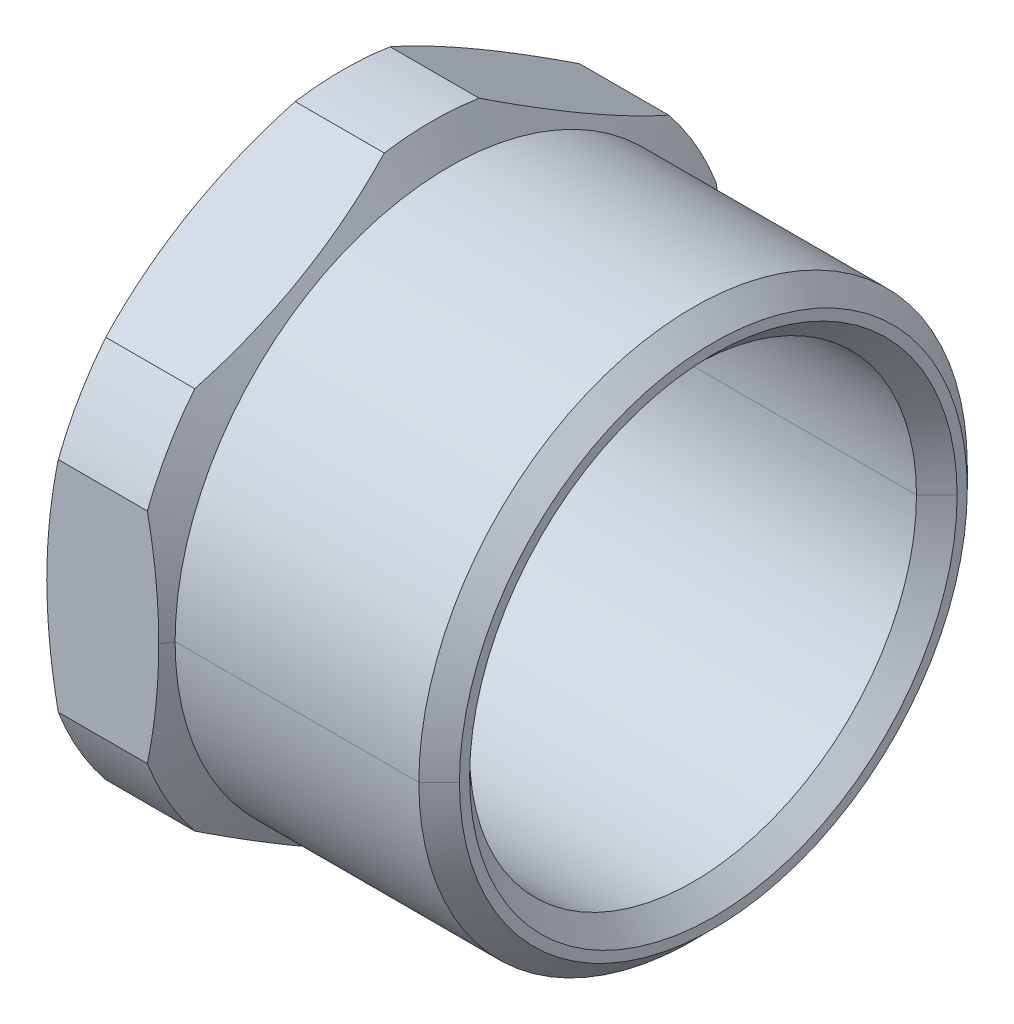
ISO-10303-21;
HEADER;
FILE_DESCRIPTION(('STEP AP214'),'2;1');
FILE_NAME('part.step','',(''),(''),'','','');
FILE_SCHEMA(('AUTOMOTIVE_DESIGN { 1 0 10303 214 1 1 1 1 }'));
ENDSEC;
DATA;
#1=APPLICATION_CONTEXT('core data for automotive mechanical design processes');
#2=APPLICATION_PROTOCOL_DEFINITION('international standard','automotive_design',2000,#1);
#3=PRODUCT_CONTEXT('',#1,'mechanical');
#4=PRODUCT('Part','Part','',(#3));
#5=PRODUCT_RELATED_PRODUCT_CATEGORY('part','',(#4));
#6=PRODUCT_DEFINITION_FORMATION('','',#4);
#7=PRODUCT_DEFINITION_CONTEXT('part definition',#1,'design');
#8=PRODUCT_DEFINITION('design','',#6,#7);
#9=PRODUCT_DEFINITION_SHAPE('','',#8);
#10=(LENGTH_UNIT() NAMED_UNIT(*) SI_UNIT(.MILLI.,.METRE.));
#11=(NAMED_UNIT(*) PLANE_ANGLE_UNIT() SI_UNIT($,.RADIAN.));
#12=(NAMED_UNIT(*) SI_UNIT($,.STERADIAN.) SOLID_ANGLE_UNIT());
#13=UNCERTAINTY_MEASURE_WITH_UNIT(LENGTH_MEASURE(1.E-05),#10,'distance_accuracy_value','');
#14=(GEOMETRIC_REPRESENTATION_CONTEXT(3) GLOBAL_UNCERTAINTY_ASSIGNED_CONTEXT((#13)) GLOBAL_UNIT_ASSIGNED_CONTEXT((#10,
#11,#12)) REPRESENTATION_CONTEXT('',''));
#15=CARTESIAN_POINT('',(0.,0.,0.));
#16=DIRECTION('',(0.,0.,1.));
#17=DIRECTION('',(1.,0.,0.));
#18=AXIS2_PLACEMENT_3D('',#15,#16,#17);
#19=CARTESIAN_POINT('',(32.5,0.,0.));
#20=DIRECTION('',(-1.,0.,0.));
#21=DIRECTION('',(0.,-1.30739807868707E-10,-1.));
#22=AXIS2_PLACEMENT_3D('',#19,#20,#21);
#23=CONICAL_SURFACE('',#22,5.5,0.7853981625);
#24=CARTESIAN_POINT('',(32.5,0.,0.));
#25=DIRECTION('',(-1.,0.,0.));
#26=DIRECTION('',(0.,1.30739807868707E-10,1.));
#27=AXIS2_PLACEMENT_3D('',#24,#25,#26);
#28=CIRCLE('',#27,5.5);
#29=CARTESIAN_POINT('',(32.5,7.19068269722149E-10,5.5));
#30=VERTEX_POINT('',#29);
#31=CARTESIAN_POINT('',(32.5,-7.19068943277889E-10,-5.5));
#32=VERTEX_POINT('',#31);
#33=EDGE_CURVE('E11',#30,#32,#28,.T.);
#34=ORIENTED_EDGE('',*,*,#33,.F.);
#35=DIRECTION('',(-0.707106781821139,9.24469180364172E-11,0.707106780551956));
#36=VECTOR('',#35,1.);
#37=CARTESIAN_POINT('',(32.5,7.19068269722149E-10,5.5));
#38=LINE('',#37,#36);
#39=CARTESIAN_POINT('',(32.,7.8443811230683E-10,5.99999999910255));
#40=VERTEX_POINT('',#39);
#41=EDGE_CURVE('E24',#30,#40,#38,.T.);
#42=ORIENTED_EDGE('',*,*,#41,.T.);
#43=CARTESIAN_POINT('',(32.,0.,0.));
#44=DIRECTION('',(1.,0.,0.));
#45=DIRECTION('',(0.,1.30739807868707E-10,1.));
#46=AXIS2_PLACEMENT_3D('',#43,#44,#45);
#47=CIRCLE('',#46,6.);
#48=CARTESIAN_POINT('',(32.,-7.8443884709491E-10,-5.99999999910255));
#49=VERTEX_POINT('',#48);
#50=EDGE_CURVE('E709',#49,#40,#47,.T.);
#51=ORIENTED_EDGE('',*,*,#50,.F.);
#52=DIRECTION('',(-0.707106781821139,-9.24470046320227E-11,-0.707106780551956));
#53=VECTOR('',#52,1.);
#54=CARTESIAN_POINT('',(32.5,-7.19068943277889E-10,-5.5));
#55=LINE('',#54,#53);
#56=EDGE_CURVE('E41',#32,#49,#55,.T.);
#57=ORIENTED_EDGE('',*,*,#56,.F.);
#58=EDGE_LOOP('',(#34,#42,#51,#57));
#59=FACE_BOUND('',#58,.T.);
#60=ADVANCED_FACE('F16',(#59),#23,.F.);
#61=CARTESIAN_POINT('',(41.5,0.,0.));
#62=DIRECTION('',(1.,0.,0.));
#63=DIRECTION('',(0.,1.30739807868707E-10,1.));
#64=AXIS2_PLACEMENT_3D('',#61,#62,#63);
#65=CONICAL_SURFACE('',#64,6.,0.785398162500002);
#66=CARTESIAN_POINT('',(41.,0.,0.));
#67=DIRECTION('',(1.,0.,0.));
#68=DIRECTION('',(0.,-1.30739807868707E-10,-1.));
#69=AXIS2_PLACEMENT_3D('',#66,#67,#68);
#70=CIRCLE('',#69,5.5);
#71=CARTESIAN_POINT('',(41.,-7.19068943277889E-10,-5.5));
#72=VERTEX_POINT('',#71);
#73=CARTESIAN_POINT('',(41.,7.19068269722149E-10,5.5));
#74=VERTEX_POINT('',#73);
#75=EDGE_CURVE('E706',#72,#74,#70,.T.);
#76=ORIENTED_EDGE('',*,*,#75,.F.);
#77=DIRECTION('',(0.707106781821138,-9.24470912276284E-11,-0.707106780551957));
#78=VECTOR('',#77,1.);
#79=CARTESIAN_POINT('',(41.5,-7.84439582000322E-10,-6.));
#80=LINE('',#79,#78);
#81=CARTESIAN_POINT('',(41.5,-7.84439582000322E-10,-6.));
#82=VERTEX_POINT('',#81);
#83=EDGE_CURVE('E838',#72,#82,#80,.T.);
#84=ORIENTED_EDGE('',*,*,#83,.T.);
#85=CARTESIAN_POINT('',(41.5,0.,0.));
#86=DIRECTION('',(-1.,0.,0.));
#87=DIRECTION('',(0.,-1.30739807868707E-10,-1.));
#88=AXIS2_PLACEMENT_3D('',#85,#86,#87);
#89=CIRCLE('',#88,6.);
#90=CARTESIAN_POINT('',(41.5,7.84438847212242E-10,6.));
#91=VERTEX_POINT('',#90);
#92=EDGE_CURVE('E835',#91,#82,#89,.T.);
#93=ORIENTED_EDGE('',*,*,#92,.F.);
#94=DIRECTION('',(0.707106781821138,9.24470046320229E-11,0.707106780551957));
#95=VECTOR('',#94,1.);
#96=CARTESIAN_POINT('',(41.5,7.84438847212242E-10,6.));
#97=LINE('',#96,#95);
#98=EDGE_CURVE('E832',#74,#91,#97,.T.);
#99=ORIENTED_EDGE('',*,*,#98,.F.);
#100=EDGE_LOOP('',(#76,#84,#93,#99));
#101=FACE_BOUND('',#100,.T.);
#102=ADVANCED_FACE('F697',(#101),#65,.F.);
#103=CARTESIAN_POINT('',(41.5,0.,0.));
#104=DIRECTION('',(-1.,0.,0.));
#105=DIRECTION('',(0.,-1.30739807868707E-10,-1.));
#106=AXIS2_PLACEMENT_3D('',#103,#104,#105);
#107=CONICAL_SURFACE('',#106,6.25,0.785398162500002);
#108=CARTESIAN_POINT('',(41.5,0.,0.));
#109=DIRECTION('',(1.,0.,0.));
#110=DIRECTION('',(0.,-1.30739807868707E-10,-1.));
#111=AXIS2_PLACEMENT_3D('',#108,#109,#110);
#112=CIRCLE('',#111,6.25);
#113=CARTESIAN_POINT('',(41.5,8.49807738227076E-10,6.25));
#114=VERTEX_POINT('',#113);
#115=CARTESIAN_POINT('',(41.5,-8.17124016019853E-10,-6.25));
#116=VERTEX_POINT('',#115);
#117=EDGE_CURVE('E829',#114,#116,#112,.T.);
#118=ORIENTED_EDGE('',*,*,#117,.F.);
#119=DIRECTION('',(-0.707106781821138,9.24469180364173E-11,0.707106780551957));
#120=VECTOR('',#119,1.);
#121=CARTESIAN_POINT('',(41.5,8.17122816934735E-10,6.25));
#122=LINE('',#121,#120);
#123=CARTESIAN_POINT('',(41.,8.82493486273338E-10,6.75));
#124=VERTEX_POINT('',#123);
#125=EDGE_CURVE('E826',#114,#124,#122,.T.);
#126=ORIENTED_EDGE('',*,*,#125,.T.);
#127=CARTESIAN_POINT('',(41.,0.,0.));
#128=DIRECTION('',(-1.,0.,0.));
#129=DIRECTION('',(0.,-1.30739807868707E-10,-1.));
#130=AXIS2_PLACEMENT_3D('',#127,#128,#129);
#131=CIRCLE('',#130,6.75);
#132=CARTESIAN_POINT('',(41.,-8.82494746590796E-10,-6.75));
#133=VERTEX_POINT('',#132);
#134=EDGE_CURVE('E823',#133,#124,#131,.T.);
#135=ORIENTED_EDGE('',*,*,#134,.F.);
#136=DIRECTION('',(-0.707106781821138,-9.24470046320229E-11,-0.707106780551957));
#137=VECTOR('',#136,1.);
#138=CARTESIAN_POINT('',(41.5,-8.17124016019853E-10,-6.25));
#139=LINE('',#138,#137);
#140=EDGE_CURVE('E810',#116,#133,#139,.T.);
#141=ORIENTED_EDGE('',*,*,#140,.F.);
#142=EDGE_LOOP('',(#118,#126,#135,#141));
#143=FACE_BOUND('',#142,.T.);
#144=ADVANCED_FACE('F601',(#143),#107,.T.);
#145=CARTESIAN_POINT('',(34.5669872981078,0.,0.));
#146=DIRECTION('',(-1.,0.,0.));
#147=DIRECTION('',(0.,-1.30739807868707E-10,-1.));
#148=AXIS2_PLACEMENT_3D('',#145,#146,#147);
#149=CONICAL_SURFACE('',#148,7.5,1.04719755);
#150=CARTESIAN_POINT('',(35.,0.,0.));
#151=DIRECTION('',(1.,0.,0.));
#152=DIRECTION('',(0.,-1.30739807868707E-10,-1.));
#153=AXIS2_PLACEMENT_3D('',#150,#151,#152);
#154=CIRCLE('',#153,6.75);
#155=CARTESIAN_POINT('',(35.,8.82493486273338E-10,6.75));
#156=VERTEX_POINT('',#155);
#157=CARTESIAN_POINT('',(35.,-8.82494746590796E-10,-6.75));
#158=VERTEX_POINT('',#157);
#159=EDGE_CURVE('E807',#156,#158,#154,.T.);
#160=ORIENTED_EDGE('',*,*,#159,.F.);
#161=DIRECTION('',(-0.500000001036284,1.13223888764452E-10,0.86602540318614));
#162=VECTOR('',#161,1.);
#163=CARTESIAN_POINT('',(34.5669872981078,9.80547423689769E-10,7.5));
#164=LINE('',#163,#162);
#165=CARTESIAN_POINT('',(34.8493881323621,-1.6731625299066E-08,7.00253407432229));
#166=VERTEX_POINT('',#165);
#167=EDGE_CURVE('E811',#156,#166,#164,.T.);
#168=ORIENTED_EDGE('',*,*,#167,.T.);
#169=CARTESIAN_POINT('',(34.5669872981078,-2.69258240265207,7.00000000035203));
#170=CARTESIAN_POINT('',(34.7530223848469,-1.79505493479531,7.00000000023469));
#171=CARTESIAN_POINT('',(34.8460399282163,-0.897527466938505,7.00000000011734));
#172=CARTESIAN_POINT('',(34.8493881323621,-1.67319566034561E-08,7.));
#173=B_SPLINE_CURVE_WITH_KNOTS('',3,(#169,#170,#171,#172),.UNSPECIFIED.,.F.,.F.,(4,4),(0.,
0.500000000000605),.UNSPECIFIED.);
#174=CARTESIAN_POINT('',(34.5669872981078,-2.69258240265207,7.00000000035203));
#175=VERTEX_POINT('',#174);
#176=EDGE_CURVE('E221',#175,#166,#173,.T.);
#177=ORIENTED_EDGE('',*,*,#176,.F.);
#178=CARTESIAN_POINT('',(34.5669872981078,0.,0.));
#179=DIRECTION('',(-1.,0.,0.));
#180=DIRECTION('',(0.,-1.30739807868707E-10,-1.));
#181=AXIS2_PLACEMENT_3D('',#178,#179,#180);
#182=CIRCLE('',#181,7.5);
#183=CARTESIAN_POINT('',(34.5669872981078,-4.71588662394499,5.83184476388876));
#184=VERTEX_POINT('',#183);
#185=EDGE_CURVE('E585',#184,#175,#182,.T.);
#186=ORIENTED_EDGE('',*,*,#185,.F.);
#187=CARTESIAN_POINT('',(34.5669872981078,-7.40846902812197,1.16815523769638));
#188=CARTESIAN_POINT('',(34.9390574715856,-6.51094156006305,2.72271841309372));
#189=CARTESIAN_POINT('',(34.9390574715856,-5.61341409200405,4.27728158849118));
#190=CARTESIAN_POINT('',(34.5669872981078,-4.71588662394499,5.83184476388876));
#191=B_SPLINE_CURVE_WITH_KNOTS('',3,(#187,#188,#189,#190),.UNSPECIFIED.,.F.,.F.,(4,4),(0.,1.),.UNSPECIFIED.);
#192=CARTESIAN_POINT('',(34.5669872981078,-7.40846902812197,1.16815523769638));
#193=VERTEX_POINT('',#192);
#194=EDGE_CURVE('E581',#193,#184,#191,.T.);
#195=ORIENTED_EDGE('',*,*,#194,.F.);
#196=CARTESIAN_POINT('',(34.5669872981078,0.,0.));
#197=DIRECTION('',(-1.,0.,0.));
#198=DIRECTION('',(0.,-1.30739807868707E-10,-1.));
#199=AXIS2_PLACEMENT_3D('',#196,#197,#198);
#200=CIRCLE('',#199,7.5);
#201=CARTESIAN_POINT('',(34.5669872981078,-7.40846902842742,-1.16815523575921));
#202=VERTEX_POINT('',#201);
#203=EDGE_CURVE('E640',#202,#193,#200,.T.);
#204=ORIENTED_EDGE('',*,*,#203,.F.);
#205=CARTESIAN_POINT('',(34.5669872981078,-4.7158866254699,-5.83184476265565));
#206=CARTESIAN_POINT('',(34.9390574715856,-5.61341409312234,-4.27728158702363));
#207=CARTESIAN_POINT('',(34.9390574715856,-6.51094156077485,-2.72271841139148));
#208=CARTESIAN_POINT('',(34.5669872981078,-7.40846902842742,-1.16815523575921));
#209=B_SPLINE_CURVE_WITH_KNOTS('',3,(#205,#206,#207,#208),.UNSPECIFIED.,.F.,.F.,(4,4),(0.,1.),.UNSPECIFIED.);
#210=CARTESIAN_POINT('',(34.5669872981078,-4.7158866254699,-5.83184476265565));
#211=VERTEX_POINT('',#210);
#212=EDGE_CURVE('E625',#211,#202,#209,.T.);
#213=ORIENTED_EDGE('',*,*,#212,.F.);
#214=CARTESIAN_POINT('',(34.5669872981078,0.,0.));
#215=DIRECTION('',(-1.,0.,0.));
#216=DIRECTION('',(0.,-1.30739807868707E-10,-1.));
#217=AXIS2_PLACEMENT_3D('',#214,#215,#216);
#218=CIRCLE('',#217,7.5);
#219=CARTESIAN_POINT('',(34.5669872981078,-2.69258240448243,-6.99999999964797));
#220=VERTEX_POINT('',#219);
#221=EDGE_CURVE('E616',#220,#211,#218,.T.);
#222=ORIENTED_EDGE('',*,*,#221,.F.);
#223=CARTESIAN_POINT('',(34.8493881356448,-6.25313117907599E-08,-7.));
#224=CARTESIAN_POINT('',(34.8460399282113,-0.897527468817098,-6.99999999988266));
#225=CARTESIAN_POINT('',(34.7530223848419,-1.79505493664975,-6.99999999976531));
#226=CARTESIAN_POINT('',(34.5669872981078,-2.69258240448243,-6.99999999964797));
#227=B_SPLINE_CURVE_WITH_KNOTS('',3,(#223,#224,#225,#226),.UNSPECIFIED.,.F.,.F.,(4,4),
(0.500000000012889,1.),.UNSPECIFIED.);
#228=CARTESIAN_POINT('',(34.8493881356448,-6.25316430953912E-08,-7.00253406863652));
#229=VERTEX_POINT('',#228);
#230=EDGE_CURVE('E654',#229,#220,#227,.T.);
#231=ORIENTED_EDGE('',*,*,#230,.F.);
#232=DIRECTION('',(-0.500000001036284,-1.13223994821975E-10,-0.86602540318614));
#233=VECTOR('',#232,1.);
#234=CARTESIAN_POINT('',(34.5669872981078,-9.80548775855737E-10,-7.5));
#235=LINE('',#234,#233);
#236=EDGE_CURVE('E407',#158,#229,#235,.T.);
#237=ORIENTED_EDGE('',*,*,#236,.F.);
#238=EDGE_LOOP('',(#160,#168,#177,#186,#195,#204,#213,#222,#231,#237));
#239=FACE_BOUND('',#238,.T.);
#240=ADVANCED_FACE('F592',(#239),#149,.T.);
#241=CARTESIAN_POINT('',(41.5,0.,0.));
#242=DIRECTION('',(-1.,0.,0.));
#243=DIRECTION('',(0.,-1.30739807868707E-10,-1.));
#244=AXIS2_PLACEMENT_3D('',#241,#242,#243);
#245=CYLINDRICAL_SURFACE('',#244,5.5);
#246=ORIENTED_EDGE('',*,*,#75,.T.);
#247=DIRECTION('',(-1.,0.,0.));
#248=VECTOR('',#247,1.);
#249=CARTESIAN_POINT('',(41.5,7.19068269722149E-10,5.5));
#250=LINE('',#249,#248);
#251=EDGE_CURVE('E660',#74,#30,#250,.T.);
#252=ORIENTED_EDGE('',*,*,#251,.T.);
#253=ORIENTED_EDGE('',*,*,#33,.T.);
#254=DIRECTION('',(-1.,0.,0.));
#255=VECTOR('',#254,1.);
#256=CARTESIAN_POINT('',(41.5,-7.19068943277889E-10,-5.5));
#257=LINE('',#256,#255);
#258=EDGE_CURVE('E663',#72,#32,#257,.T.);
#259=ORIENTED_EDGE('',*,*,#258,.F.);
#260=EDGE_LOOP('',(#246,#252,#253,#259));
#261=FACE_BOUND('',#260,.T.);
#262=ADVANCED_FACE('F523',(#261),#245,.F.);
#263=CARTESIAN_POINT('',(32.3752776749733,0.,0.));
#264=DIRECTION('',(1.,0.,0.));
#265=DIRECTION('',(0.,1.30739807868707E-10,1.));
#266=AXIS2_PLACEMENT_3D('',#263,#264,#265);
#267=CONICAL_SURFACE('',#266,7.5,1.04719755);
#268=CARTESIAN_POINT('',(32.,0.,0.));
#269=DIRECTION('',(-1.,0.,0.));
#270=DIRECTION('',(0.,1.30739807868707E-10,1.));
#271=AXIS2_PLACEMENT_3D('',#268,#269,#270);
#272=CIRCLE('',#271,6.85);
#273=CARTESIAN_POINT('',(32.,-9.38059216982486E-10,-6.85));
#274=VERTEX_POINT('',#273);
#275=CARTESIAN_POINT('',(32.,8.95567467060209E-10,6.85));
#276=VERTEX_POINT('',#275);
#277=EDGE_CURVE('E670',#274,#276,#272,.T.);
#278=ORIENTED_EDGE('',*,*,#277,.F.);
#279=DIRECTION('',(0.500000001036283,-1.13224100879499E-10,-0.866025403186141));
#280=VECTOR('',#279,1.);
#281=CARTESIAN_POINT('',(32.3752776749733,-9.80549694340836E-10,-7.5));
#282=LINE('',#281,#280);
#283=CARTESIAN_POINT('',(32.092876840719,-1.85626435755762E-08,-7.00253407432229));
#284=VERTEX_POINT('',#283);
#285=EDGE_CURVE('E367',#274,#284,#282,.T.);
#286=ORIENTED_EDGE('',*,*,#285,.T.);
#287=CARTESIAN_POINT('',(32.3752776749733,-2.69258240448243,-6.99999999964797));
#288=CARTESIAN_POINT('',(32.1892425882342,-1.79505493662567,-6.99999999976531));
#289=CARTESIAN_POINT('',(32.0962250448648,-0.897527468768869,-6.99999999988266));
#290=CARTESIAN_POINT('',(32.092876840719,-1.85623122702015E-08,-7.));
#291=B_SPLINE_CURVE_WITH_KNOTS('',3,(#287,#288,#289,#290),.UNSPECIFIED.,.F.,.F.,(4,4),(0.,
0.500000000000607),.UNSPECIFIED.);
#292=CARTESIAN_POINT('',(32.3752776749733,-2.69258240448243,-6.99999999964797));
#293=VERTEX_POINT('',#292);
#294=EDGE_CURVE('E674',#293,#284,#291,.T.);
#295=ORIENTED_EDGE('',*,*,#294,.F.);
#296=CARTESIAN_POINT('',(32.3752776749733,0.,0.));
#297=DIRECTION('',(1.,0.,0.));
#298=DIRECTION('',(0.,1.30739807868707E-10,1.));
#299=AXIS2_PLACEMENT_3D('',#296,#297,#298);
#300=CIRCLE('',#299,7.5);
#301=CARTESIAN_POINT('',(32.3752776749733,-4.7158866254699,-5.83184476265565));
#302=VERTEX_POINT('',#301);
#303=EDGE_CURVE('E686',#302,#293,#300,.T.);
#304=ORIENTED_EDGE('',*,*,#303,.F.);
#305=CARTESIAN_POINT('',(32.3752776749733,-7.40846902842742,-1.16815523575921));
#306=CARTESIAN_POINT('',(32.0032075014955,-6.51094156077499,-2.72271841139122));
#307=CARTESIAN_POINT('',(32.0032075014955,-5.61341409312248,-4.27728158702337));
#308=CARTESIAN_POINT('',(32.3752776749733,-4.7158866254699,-5.83184476265565));
#309=B_SPLINE_CURVE_WITH_KNOTS('',3,(#305,#306,#307,#308),.UNSPECIFIED.,.F.,.F.,(4,4),(0.,1.),.UNSPECIFIED.);
#310=CARTESIAN_POINT('',(32.3752776749733,-7.40846902842742,-1.16815523575921));
#311=VERTEX_POINT('',#310);
#312=EDGE_CURVE('E690',#311,#302,#309,.T.);
#313=ORIENTED_EDGE('',*,*,#312,.F.);
#314=CARTESIAN_POINT('',(32.3752776749733,0.,0.));
#315=DIRECTION('',(1.,0.,0.));
#316=DIRECTION('',(0.,1.30739807868707E-10,1.));
#317=AXIS2_PLACEMENT_3D('',#314,#315,#316);
#318=CIRCLE('',#317,7.5);
#319=CARTESIAN_POINT('',(32.3752776749733,-7.40846902812197,1.16815523769638));
#320=VERTEX_POINT('',#319);
#321=EDGE_CURVE('E758',#320,#311,#318,.T.);
#322=ORIENTED_EDGE('',*,*,#321,.F.);
#323=CARTESIAN_POINT('',(32.3752776749733,-4.71588662394499,5.83184476388876));
#324=CARTESIAN_POINT('',(32.0032075014955,-5.61341409200391,4.27728158849144));
#325=CARTESIAN_POINT('',(32.0032075014955,-6.5109415600629,2.72271841309398));
#326=CARTESIAN_POINT('',(32.3752776749733,-7.40846902812197,1.16815523769638));
#327=B_SPLINE_CURVE_WITH_KNOTS('',3,(#323,#324,#325,#326),.UNSPECIFIED.,.F.,.F.,(4,4),(0.,1.),.UNSPECIFIED.);
#328=CARTESIAN_POINT('',(32.3752776749733,-4.71588662394499,5.83184476388876));
#329=VERTEX_POINT('',#328);
#330=EDGE_CURVE('E550',#329,#320,#327,.T.);
#331=ORIENTED_EDGE('',*,*,#330,.F.);
#332=CARTESIAN_POINT('',(32.3752776749733,0.,0.));
#333=DIRECTION('',(1.,0.,0.));
#334=DIRECTION('',(0.,1.30739807868707E-10,1.));
#335=AXIS2_PLACEMENT_3D('',#332,#333,#334);
#336=CIRCLE('',#335,7.5);
#337=CARTESIAN_POINT('',(32.3752776749733,-2.69258240265207,7.00000000035203));
#338=VERTEX_POINT('',#337);
#339=EDGE_CURVE('E541',#338,#329,#336,.T.);
#340=ORIENTED_EDGE('',*,*,#339,.F.);
#341=CARTESIAN_POINT('',(32.0928768374364,-6.07009589203298E-08,7.));
#342=CARTESIAN_POINT('',(32.0962250448698,-0.897527466986735,7.00000000011734));
#343=CARTESIAN_POINT('',(32.1892425882392,-1.79505493481938,7.00000000023469));
#344=CARTESIAN_POINT('',(32.3752776749733,-2.69258240265207,7.00000000035203));
#345=B_SPLINE_CURVE_WITH_KNOTS('',3,(#341,#342,#343,#344),.UNSPECIFIED.,.F.,.F.,(4,4),
(0.500000000012891,1.),.UNSPECIFIED.);
#346=CARTESIAN_POINT('',(32.0928768374364,-6.07006276166832E-08,7.00253406863652));
#347=VERTEX_POINT('',#346);
#348=EDGE_CURVE('E506',#347,#338,#345,.T.);
#349=ORIENTED_EDGE('',*,*,#348,.F.);
#350=DIRECTION('',(0.500000001036283,1.13223994821976E-10,0.866025403186141));
#351=VECTOR('',#350,1.);
#352=CARTESIAN_POINT('',(32.3752776749733,9.80548342174868E-10,7.5));
#353=LINE('',#352,#351);
#354=EDGE_CURVE('E501',#276,#347,#353,.T.);
#355=ORIENTED_EDGE('',*,*,#354,.F.);
#356=EDGE_LOOP('',(#278,#286,#295,#304,#313,#322,#331,#340,#349,#355));
#357=FACE_BOUND('',#356,.T.);
#358=ADVANCED_FACE('F512',(#357),#267,.T.);
#359=CARTESIAN_POINT('',(38.25,0.,0.));
#360=DIRECTION('',(1.,0.,0.));
#361=DIRECTION('',(0.,1.30739807868707E-10,1.));
#362=AXIS2_PLACEMENT_3D('',#359,#360,#361);
#363=CYLINDRICAL_SURFACE('',#362,6.75);
#364=ORIENTED_EDGE('',*,*,#159,.T.);
#365=DIRECTION('',(1.,0.,0.));
#366=VECTOR('',#365,1.);
#367=CARTESIAN_POINT('',(38.25,-8.82494746590796E-10,-6.75));
#368=LINE('',#367,#366);
#369=EDGE_CURVE('E497',#158,#133,#368,.T.);
#370=ORIENTED_EDGE('',*,*,#369,.T.);
#371=ORIENTED_EDGE('',*,*,#134,.T.);
#372=DIRECTION('',(1.,0.,0.));
#373=VECTOR('',#372,1.);
#374=CARTESIAN_POINT('',(38.25,8.82493486273338E-10,6.75));
#375=LINE('',#374,#373);
#376=EDGE_CURVE('E494',#156,#124,#375,.T.);
#377=ORIENTED_EDGE('',*,*,#376,.F.);
#378=EDGE_LOOP('',(#364,#370,#371,#377));
#379=FACE_BOUND('',#378,.T.);
#380=ADVANCED_FACE('F522',(#379),#363,.T.);
#381=CARTESIAN_POINT('',(32.,0.,0.));
#382=DIRECTION('',(1.,0.,0.));
#383=DIRECTION('',(0.,1.30739807868707E-10,1.));
#384=AXIS2_PLACEMENT_3D('',#381,#382,#383);
#385=CYLINDRICAL_SURFACE('',#384,7.5);
#386=DIRECTION('',(-1.,0.,0.));
#387=VECTOR('',#386,1.);
#388=CARTESIAN_POINT('',(32.,7.40846902842742,1.16815523575921));
#389=LINE('',#388,#387);
#390=CARTESIAN_POINT('',(34.5669872981078,7.40846902842742,1.16815523575921));
#391=VERTEX_POINT('',#390);
#392=CARTESIAN_POINT('',(32.3752776749733,7.40846902842742,1.16815523575921));
#393=VERTEX_POINT('',#392);
#394=EDGE_CURVE('E418',#391,#393,#389,.T.);
#395=ORIENTED_EDGE('',*,*,#394,.F.);
#396=CARTESIAN_POINT('',(34.5669872981078,0.,0.));
#397=DIRECTION('',(-1.,0.,0.));
#398=DIRECTION('',(0.,-1.30739807868707E-10,-1.));
#399=AXIS2_PLACEMENT_3D('',#396,#397,#398);
#400=CIRCLE('',#399,7.5);
#401=CARTESIAN_POINT('',(34.5669872981078,7.40846902812197,-1.16815523769638));
#402=VERTEX_POINT('',#401);
#403=EDGE_CURVE('E486',#391,#402,#400,.T.);
#404=ORIENTED_EDGE('',*,*,#403,.T.);
#405=DIRECTION('',(1.,0.,0.));
#406=VECTOR('',#405,1.);
#407=CARTESIAN_POINT('',(32.,7.40846902812197,-1.16815523769638));
#408=LINE('',#407,#406);
#409=CARTESIAN_POINT('',(32.3752776749733,7.40846902812197,-1.16815523769638));
#410=VERTEX_POINT('',#409);
#411=EDGE_CURVE('E481',#410,#402,#408,.T.);
#412=ORIENTED_EDGE('',*,*,#411,.F.);
#413=CARTESIAN_POINT('',(32.3752776749733,0.,0.));
#414=DIRECTION('',(1.,0.,0.));
#415=DIRECTION('',(0.,1.30739807868707E-10,1.));
#416=AXIS2_PLACEMENT_3D('',#413,#414,#415);
#417=CIRCLE('',#416,7.5);
#418=EDGE_CURVE('E477',#410,#393,#417,.T.);
#419=ORIENTED_EDGE('',*,*,#418,.T.);
#420=EDGE_LOOP('',(#395,#404,#412,#419));
#421=FACE_BOUND('',#420,.T.);
#422=ADVANCED_FACE('F795',(#421),#385,.T.);
#423=CARTESIAN_POINT('',(32.,0.,0.));
#424=DIRECTION('',(1.,0.,0.));
#425=DIRECTION('',(0.,1.30739807868707E-10,1.));
#426=AXIS2_PLACEMENT_3D('',#423,#424,#425);
#427=CYLINDRICAL_SURFACE('',#426,7.5);
#428=DIRECTION('',(-1.,0.,0.));
#429=VECTOR('',#428,1.);
#430=CARTESIAN_POINT('',(32.,4.71588662394499,-5.83184476388876));
#431=LINE('',#430,#429);
#432=CARTESIAN_POINT('',(34.5669872981078,4.71588662394499,-5.83184476388876));
#433=VERTEX_POINT('',#432);
#434=CARTESIAN_POINT('',(32.3752776749733,4.71588662394499,-5.83184476388876));
#435=VERTEX_POINT('',#434);
#436=EDGE_CURVE('E472',#433,#435,#431,.T.);
#437=ORIENTED_EDGE('',*,*,#436,.F.);
#438=CARTESIAN_POINT('',(34.5669872981078,0.,0.));
#439=DIRECTION('',(-1.,0.,0.));
#440=DIRECTION('',(0.,-1.30739807868707E-10,-1.));
#441=AXIS2_PLACEMENT_3D('',#438,#439,#440);
#442=CIRCLE('',#441,7.5);
#443=CARTESIAN_POINT('',(34.5669872981078,2.69258240265207,-7.00000000035203));
#444=VERTEX_POINT('',#443);
#445=EDGE_CURVE('E404',#433,#444,#442,.T.);
#446=ORIENTED_EDGE('',*,*,#445,.T.);
#447=DIRECTION('',(1.,0.,0.));
#448=VECTOR('',#447,1.);
#449=CARTESIAN_POINT('',(32.,2.69258240265207,-7.00000000035203));
#450=LINE('',#449,#448);
#451=CARTESIAN_POINT('',(32.3752776749733,2.69258240265207,-7.00000000035203));
#452=VERTEX_POINT('',#451);
#453=EDGE_CURVE('E464',#452,#444,#450,.T.);
#454=ORIENTED_EDGE('',*,*,#453,.F.);
#455=CARTESIAN_POINT('',(32.3752776749733,0.,0.));
#456=DIRECTION('',(1.,0.,0.));
#457=DIRECTION('',(0.,1.30739807868707E-10,1.));
#458=AXIS2_PLACEMENT_3D('',#455,#456,#457);
#459=CIRCLE('',#458,7.5);
#460=EDGE_CURVE('E370',#452,#435,#459,.T.);
#461=ORIENTED_EDGE('',*,*,#460,.T.);
#462=EDGE_LOOP('',(#437,#446,#454,#461));
#463=FACE_BOUND('',#462,.T.);
#464=ADVANCED_FACE('F790',(#463),#427,.T.);
#465=CARTESIAN_POINT('',(32.,0.,0.));
#466=DIRECTION('',(1.,0.,0.));
#467=DIRECTION('',(0.,1.30739807868707E-10,1.));
#468=AXIS2_PLACEMENT_3D('',#465,#466,#467);
#469=CYLINDRICAL_SURFACE('',#468,7.5);
#470=DIRECTION('',(-1.,0.,0.));
#471=VECTOR('',#470,1.);
#472=CARTESIAN_POINT('',(32.,-2.69258240448243,-6.99999999964797));
#473=LINE('',#472,#471);
#474=EDGE_CURVE('E454',#220,#293,#473,.T.);
#475=ORIENTED_EDGE('',*,*,#474,.F.);
#476=ORIENTED_EDGE('',*,*,#221,.T.);
#477=DIRECTION('',(1.,0.,0.));
#478=VECTOR('',#477,1.);
#479=CARTESIAN_POINT('',(32.,-4.7158866254699,-5.83184476265565));
#480=LINE('',#479,#478);
#481=EDGE_CURVE('E448',#302,#211,#480,.T.);
#482=ORIENTED_EDGE('',*,*,#481,.F.);
#483=ORIENTED_EDGE('',*,*,#303,.T.);
#484=EDGE_LOOP('',(#475,#476,#482,#483));
#485=FACE_BOUND('',#484,.T.);
#486=ADVANCED_FACE('F689',(#485),#469,.T.);
#487=CARTESIAN_POINT('',(32.,0.,0.));
#488=DIRECTION('',(1.,0.,0.));
#489=DIRECTION('',(0.,1.30739807868707E-10,1.));
#490=AXIS2_PLACEMENT_3D('',#487,#488,#489);
#491=CYLINDRICAL_SURFACE('',#490,7.5);
#492=DIRECTION('',(-1.,0.,0.));
#493=VECTOR('',#492,1.);
#494=CARTESIAN_POINT('',(32.,-7.40846902842742,-1.16815523575921));
#495=LINE('',#494,#493);
#496=EDGE_CURVE('E443',#202,#311,#495,.T.);
#497=ORIENTED_EDGE('',*,*,#496,.F.);
#498=ORIENTED_EDGE('',*,*,#203,.T.);
#499=DIRECTION('',(1.,0.,0.));
#500=VECTOR('',#499,1.);
#501=CARTESIAN_POINT('',(32.,-7.40846902812197,1.16815523769638));
#502=LINE('',#501,#500);
#503=EDGE_CURVE('E438',#320,#193,#502,.T.);
#504=ORIENTED_EDGE('',*,*,#503,.F.);
#505=ORIENTED_EDGE('',*,*,#321,.T.);
#506=EDGE_LOOP('',(#497,#498,#504,#505));
#507=FACE_BOUND('',#506,.T.);
#508=ADVANCED_FACE('F781',(#507),#491,.T.);
#509=CARTESIAN_POINT('',(32.,0.,0.));
#510=DIRECTION('',(1.,0.,0.));
#511=DIRECTION('',(0.,1.30739807868707E-10,1.));
#512=AXIS2_PLACEMENT_3D('',#509,#510,#511);
#513=CYLINDRICAL_SURFACE('',#512,7.5);
#514=DIRECTION('',(-1.,0.,0.));
#515=VECTOR('',#514,1.);
#516=CARTESIAN_POINT('',(32.,-4.71588662394499,5.83184476388876));
#517=LINE('',#516,#515);
#518=EDGE_CURVE('E425',#184,#329,#517,.T.);
#519=ORIENTED_EDGE('',*,*,#518,.F.);
#520=ORIENTED_EDGE('',*,*,#185,.T.);
#521=DIRECTION('',(1.,0.,0.));
#522=VECTOR('',#521,1.);
#523=CARTESIAN_POINT('',(32.,-2.69258240265207,7.00000000035203));
#524=LINE('',#523,#522);
#525=EDGE_CURVE('E422',#338,#175,#524,.T.);
#526=ORIENTED_EDGE('',*,*,#525,.F.);
#527=ORIENTED_EDGE('',*,*,#339,.T.);
#528=EDGE_LOOP('',(#519,#520,#526,#527));
#529=FACE_BOUND('',#528,.T.);
#530=ADVANCED_FACE('F783',(#529),#513,.T.);
#531=CARTESIAN_POINT('',(32.,0.,0.));
#532=DIRECTION('',(1.,0.,0.));
#533=DIRECTION('',(0.,1.30739807868707E-10,1.));
#534=AXIS2_PLACEMENT_3D('',#531,#532,#533);
#535=CYLINDRICAL_SURFACE('',#534,7.5);
#536=DIRECTION('',(1.,0.,0.));
#537=VECTOR('',#536,1.);
#538=CARTESIAN_POINT('',(32.,4.71588662546991,5.83184476265565));
#539=LINE('',#538,#537);
#540=CARTESIAN_POINT('',(32.3752776749733,4.71588662546991,5.83184476265565));
#541=VERTEX_POINT('',#540);
#542=CARTESIAN_POINT('',(34.5669872981078,4.71588662546991,5.83184476265565));
#543=VERTEX_POINT('',#542);
#544=EDGE_CURVE('E420',#541,#543,#539,.T.);
#545=ORIENTED_EDGE('',*,*,#544,.F.);
#546=CARTESIAN_POINT('',(32.3752776749733,0.,0.));
#547=DIRECTION('',(1.,0.,0.));
#548=DIRECTION('',(0.,1.30739807868707E-10,1.));
#549=AXIS2_PLACEMENT_3D('',#546,#547,#548);
#550=CIRCLE('',#549,7.5);
#551=CARTESIAN_POINT('',(32.3752776749733,2.69258240448243,6.99999999964797));
#552=VERTEX_POINT('',#551);
#553=EDGE_CURVE('E197',#541,#552,#550,.T.);
#554=ORIENTED_EDGE('',*,*,#553,.T.);
#555=DIRECTION('',(-1.,0.,0.));
#556=VECTOR('',#555,1.);
#557=CARTESIAN_POINT('',(32.,2.69258240448243,6.99999999964797));
#558=LINE('',#557,#556);
#559=CARTESIAN_POINT('',(34.5669872981078,2.69258240448243,6.99999999964797));
#560=VERTEX_POINT('',#559);
#561=EDGE_CURVE('E191',#560,#552,#558,.T.);
#562=ORIENTED_EDGE('',*,*,#561,.F.);
#563=CARTESIAN_POINT('',(34.5669872981078,0.,0.));
#564=DIRECTION('',(-1.,0.,0.));
#565=DIRECTION('',(0.,-1.30739807868707E-10,-1.));
#566=AXIS2_PLACEMENT_3D('',#563,#564,#565);
#567=CIRCLE('',#566,7.5);
#568=EDGE_CURVE('E194',#560,#543,#567,.T.);
#569=ORIENTED_EDGE('',*,*,#568,.T.);
#570=EDGE_LOOP('',(#545,#554,#562,#569));
#571=FACE_BOUND('',#570,.T.);
#572=ADVANCED_FACE('F193',(#571),#535,.T.);
#573=CARTESIAN_POINT('',(32.,0.,0.));
#574=DIRECTION('',(-1.,0.,0.));
#575=DIRECTION('',(0.,0.,1.));
#576=AXIS2_PLACEMENT_3D('',#573,#574,#575);
#577=PLANE('',#576);
#578=ORIENTED_EDGE('',*,*,#50,.T.);
#579=CARTESIAN_POINT('',(32.,0.,0.));
#580=DIRECTION('',(1.,0.,0.));
#581=DIRECTION('',(0.,1.30739807868707E-10,1.));
#582=AXIS2_PLACEMENT_3D('',#579,#580,#581);
#583=CIRCLE('',#582,6.);
#584=EDGE_CURVE('E215',#40,#49,#583,.T.);
#585=ORIENTED_EDGE('',*,*,#584,.T.);
#586=EDGE_LOOP('',(#578,#585));
#587=FACE_BOUND('',#586,.T.);
#588=CARTESIAN_POINT('',(32.,0.,0.));
#589=DIRECTION('',(-1.,0.,0.));
#590=DIRECTION('',(0.,1.30739807868707E-10,1.));
#591=AXIS2_PLACEMENT_3D('',#588,#589,#590);
#592=CIRCLE('',#591,6.85);
#593=EDGE_CURVE('E716',#276,#274,#592,.T.);
#594=ORIENTED_EDGE('',*,*,#593,.T.);
#595=ORIENTED_EDGE('',*,*,#277,.T.);
#596=EDGE_LOOP('',(#594,#595));
#597=FACE_BOUND('',#596,.T.);
#598=ADVANCED_FACE('F714',(#587,#597),#577,.T.);
#599=CARTESIAN_POINT('',(38.25,0.,0.));
#600=DIRECTION('',(1.,0.,0.));
#601=DIRECTION('',(0.,1.30739807868707E-10,1.));
#602=AXIS2_PLACEMENT_3D('',#599,#600,#601);
#603=CYLINDRICAL_SURFACE('',#602,6.75);
#604=ORIENTED_EDGE('',*,*,#369,.F.);
#605=CARTESIAN_POINT('',(35.,0.,0.));
#606=DIRECTION('',(1.,0.,0.));
#607=DIRECTION('',(0.,-1.30739807868707E-10,-1.));
#608=AXIS2_PLACEMENT_3D('',#605,#606,#607);
#609=CIRCLE('',#608,6.75);
#610=EDGE_CURVE('E719',#158,#156,#609,.T.);
#611=ORIENTED_EDGE('',*,*,#610,.T.);
#612=ORIENTED_EDGE('',*,*,#376,.T.);
#613=CARTESIAN_POINT('',(41.,0.,0.));
#614=DIRECTION('',(-1.,0.,0.));
#615=DIRECTION('',(0.,-1.30739807868707E-10,-1.));
#616=AXIS2_PLACEMENT_3D('',#613,#614,#615);
#617=CIRCLE('',#616,6.75);
#618=EDGE_CURVE('E731',#124,#133,#617,.T.);
#619=ORIENTED_EDGE('',*,*,#618,.T.);
#620=EDGE_LOOP('',(#604,#611,#612,#619));
#621=FACE_BOUND('',#620,.T.);
#622=ADVANCED_FACE('F814',(#621),#603,.T.);
#623=CARTESIAN_POINT('',(41.5,0.,0.));
#624=DIRECTION('',(1.,0.,0.));
#625=DIRECTION('',(0.,1.,0.));
#626=AXIS2_PLACEMENT_3D('',#623,#624,#625);
#627=PLANE('',#626);
#628=ORIENTED_EDGE('',*,*,#92,.T.);
#629=CARTESIAN_POINT('',(41.5,0.,0.));
#630=DIRECTION('',(-1.,0.,0.));
#631=DIRECTION('',(0.,-1.30739807868707E-10,-1.));
#632=AXIS2_PLACEMENT_3D('',#629,#630,#631);
#633=CIRCLE('',#632,6.);
#634=EDGE_CURVE('E734',#82,#91,#633,.T.);
#635=ORIENTED_EDGE('',*,*,#634,.T.);
#636=EDGE_LOOP('',(#628,#635));
#637=FACE_BOUND('',#636,.T.);
#638=CARTESIAN_POINT('',(41.5,0.,0.));
#639=DIRECTION('',(1.,0.,0.));
#640=DIRECTION('',(0.,-1.30739807868707E-10,-1.));
#641=AXIS2_PLACEMENT_3D('',#638,#639,#640);
#642=CIRCLE('',#641,6.25);
#643=EDGE_CURVE('E737',#116,#114,#642,.T.);
#644=ORIENTED_EDGE('',*,*,#643,.T.);
#645=ORIENTED_EDGE('',*,*,#117,.T.);
#646=EDGE_LOOP('',(#644,#645));
#647=FACE_BOUND('',#646,.T.);
#648=ADVANCED_FACE('F326',(#637,#647),#627,.T.);
#649=CARTESIAN_POINT('',(32.3752776749733,0.,0.));
#650=DIRECTION('',(1.,0.,0.));
#651=DIRECTION('',(0.,1.30739807868707E-10,1.));
#652=AXIS2_PLACEMENT_3D('',#649,#650,#651);
#653=CONICAL_SURFACE('',#652,7.5,1.04719755);
#654=ORIENTED_EDGE('',*,*,#285,.F.);
#655=ORIENTED_EDGE('',*,*,#593,.F.);
#656=ORIENTED_EDGE('',*,*,#354,.T.);
#657=CARTESIAN_POINT('',(32.3752776749733,2.69258240448243,6.99999999964797));
#658=CARTESIAN_POINT('',(32.1892425882296,1.79505493660362,6.99999999976531));
#659=CARTESIAN_POINT('',(32.0962250448602,0.897527468724765,6.99999999988266));
#660=CARTESIAN_POINT('',(32.0928768374364,-6.07009589203298E-08,7.));
#661=B_SPLINE_CURVE_WITH_KNOTS('',3,(#657,#658,#659,#660),.UNSPECIFIED.,.F.,.F.,(4,4),(0.,
0.500000000012891),.UNSPECIFIED.);
#662=EDGE_CURVE('E741',#552,#347,#661,.T.);
#663=ORIENTED_EDGE('',*,*,#662,.F.);
#664=ORIENTED_EDGE('',*,*,#553,.F.);
#665=CARTESIAN_POINT('',(32.3752776749733,7.40846902842742,1.16815523575921));
#666=CARTESIAN_POINT('',(32.0032075014955,6.51094156077499,2.72271841139122));
#667=CARTESIAN_POINT('',(32.0032075014955,5.61341409312249,4.27728158702337));
#668=CARTESIAN_POINT('',(32.3752776749733,4.7158866254699,5.83184476265565));
#669=B_SPLINE_CURVE_WITH_KNOTS('',3,(#665,#666,#667,#668),.UNSPECIFIED.,.F.,.F.,(4,4),(0.,1.),.UNSPECIFIED.);
#670=EDGE_CURVE('E377',#393,#541,#669,.T.);
#671=ORIENTED_EDGE('',*,*,#670,.F.);
#672=ORIENTED_EDGE('',*,*,#418,.F.);
#673=CARTESIAN_POINT('',(32.3752776749733,4.71588662394499,-5.83184476388876));
#674=CARTESIAN_POINT('',(32.0032075014955,5.61341409200391,-4.27728158849144));
#675=CARTESIAN_POINT('',(32.0032075014955,6.5109415600629,-2.72271841309398));
#676=CARTESIAN_POINT('',(32.3752776749733,7.40846902812197,-1.16815523769638));
#677=B_SPLINE_CURVE_WITH_KNOTS('',3,(#673,#674,#675,#676),.UNSPECIFIED.,.F.,.F.,(4,4),(0.,1.),.UNSPECIFIED.);
#678=EDGE_CURVE('E311',#435,#410,#677,.T.);
#679=ORIENTED_EDGE('',*,*,#678,.F.);
#680=ORIENTED_EDGE('',*,*,#460,.F.);
#681=CARTESIAN_POINT('',(32.092876840719,-1.85623122702015E-08,-7.));
#682=CARTESIAN_POINT('',(32.0962250448652,0.89752746694263,-7.00000000011734));
#683=CARTESIAN_POINT('',(32.1892425882346,1.79505493479733,-7.00000000023469));
#684=CARTESIAN_POINT('',(32.3752776749733,2.69258240265207,-7.00000000035203));
#685=B_SPLINE_CURVE_WITH_KNOTS('',3,(#681,#682,#683,#684),.UNSPECIFIED.,.F.,.F.,(4,4),
(0.500000000000607,1.),.UNSPECIFIED.);
#686=EDGE_CURVE('E356',#284,#452,#685,.T.);
#687=ORIENTED_EDGE('',*,*,#686,.F.);
#688=EDGE_LOOP('',(#654,#655,#656,#663,#664,#671,#672,#679,#680,#687));
#689=FACE_BOUND('',#688,.T.);
#690=ADVANCED_FACE('F317',(#689),#653,.T.);
#691=CARTESIAN_POINT('',(41.5,0.,0.));
#692=DIRECTION('',(-1.,0.,0.));
#693=DIRECTION('',(0.,-1.30739807868707E-10,-1.));
#694=AXIS2_PLACEMENT_3D('',#691,#692,#693);
#695=CYLINDRICAL_SURFACE('',#694,5.5);
#696=ORIENTED_EDGE('',*,*,#251,.F.);
#697=CARTESIAN_POINT('',(41.,0.,0.));
#698=DIRECTION('',(1.,0.,0.));
#699=DIRECTION('',(0.,-1.30739807868707E-10,-1.));
#700=AXIS2_PLACEMENT_3D('',#697,#698,#699);
#701=CIRCLE('',#700,5.5);
#702=EDGE_CURVE('E372',#74,#72,#701,.T.);
#703=ORIENTED_EDGE('',*,*,#702,.T.);
#704=ORIENTED_EDGE('',*,*,#258,.T.);
#705=CARTESIAN_POINT('',(32.5,0.,0.));
#706=DIRECTION('',(-1.,0.,0.));
#707=DIRECTION('',(0.,1.30739807868707E-10,1.));
#708=AXIS2_PLACEMENT_3D('',#705,#706,#707);
#709=CIRCLE('',#708,5.5);
#710=EDGE_CURVE('E380',#32,#30,#709,.T.);
#711=ORIENTED_EDGE('',*,*,#710,.T.);
#712=EDGE_LOOP('',(#696,#703,#704,#711));
#713=FACE_BOUND('',#712,.T.);
#714=ADVANCED_FACE('F240',(#713),#695,.F.);
#715=CARTESIAN_POINT('',(34.5669872981078,0.,0.));
#716=DIRECTION('',(-1.,0.,0.));
#717=DIRECTION('',(0.,-1.30739807868707E-10,-1.));
#718=AXIS2_PLACEMENT_3D('',#715,#716,#717);
#719=CONICAL_SURFACE('',#718,7.5,1.04719755);
#720=ORIENTED_EDGE('',*,*,#167,.F.);
#721=ORIENTED_EDGE('',*,*,#610,.F.);
#722=ORIENTED_EDGE('',*,*,#236,.T.);
#723=CARTESIAN_POINT('',(34.5669872981078,2.69258240265207,-7.00000000035203));
#724=CARTESIAN_POINT('',(34.7530223848515,1.79505493477325,-7.00000000023469));
#725=CARTESIAN_POINT('',(34.8460399282209,0.897527466894402,-7.00000000011734));
#726=CARTESIAN_POINT('',(34.8493881356448,-6.25313117907599E-08,-7.));
#727=B_SPLINE_CURVE_WITH_KNOTS('',3,(#723,#724,#725,#726),.UNSPECIFIED.,.F.,.F.,(4,4),(0.,
0.500000000012889),.UNSPECIFIED.);
#728=EDGE_CURVE('E389',#444,#229,#727,.T.);
#729=ORIENTED_EDGE('',*,*,#728,.F.);
#730=ORIENTED_EDGE('',*,*,#445,.F.);
#731=CARTESIAN_POINT('',(34.5669872981078,7.40846902812197,-1.16815523769638));
#732=CARTESIAN_POINT('',(34.9390574715856,6.51094156006305,-2.72271841309372));
#733=CARTESIAN_POINT('',(34.9390574715856,5.61341409200405,-4.27728158849118));
#734=CARTESIAN_POINT('',(34.5669872981078,4.71588662394499,-5.83184476388876));
#735=B_SPLINE_CURVE_WITH_KNOTS('',3,(#731,#732,#733,#734),.UNSPECIFIED.,.F.,.F.,(4,4),(0.,1.),.UNSPECIFIED.);
#736=EDGE_CURVE('E274',#402,#433,#735,.T.);
#737=ORIENTED_EDGE('',*,*,#736,.F.);
#738=ORIENTED_EDGE('',*,*,#403,.F.);
#739=CARTESIAN_POINT('',(34.5669872981078,4.7158866254699,5.83184476265565));
#740=CARTESIAN_POINT('',(34.9390574715856,5.61341409312234,4.27728158702363));
#741=CARTESIAN_POINT('',(34.9390574715856,6.51094156077484,2.72271841139148));
#742=CARTESIAN_POINT('',(34.5669872981078,7.40846902842742,1.16815523575921));
#743=B_SPLINE_CURVE_WITH_KNOTS('',3,(#739,#740,#741,#742),.UNSPECIFIED.,.F.,.F.,(4,4),(0.,1.),.UNSPECIFIED.);
#744=EDGE_CURVE('E212',#543,#391,#743,.T.);
#745=ORIENTED_EDGE('',*,*,#744,.F.);
#746=ORIENTED_EDGE('',*,*,#568,.F.);
#747=CARTESIAN_POINT('',(34.8493881323621,-1.67319566034561E-08,7.));
#748=CARTESIAN_POINT('',(34.8460399282159,0.897527468772995,6.99999999988266));
#749=CARTESIAN_POINT('',(34.7530223848465,1.7950549366277,6.99999999976531));
#750=CARTESIAN_POINT('',(34.5669872981078,2.69258240448243,6.99999999964797));
#751=B_SPLINE_CURVE_WITH_KNOTS('',3,(#747,#748,#749,#750),.UNSPECIFIED.,.F.,.F.,(4,4),
(0.500000000000605,1.),.UNSPECIFIED.);
#752=EDGE_CURVE('E208',#166,#560,#751,.T.);
#753=ORIENTED_EDGE('',*,*,#752,.F.);
#754=EDGE_LOOP('',(#720,#721,#722,#729,#730,#737,#738,#745,#746,#753));
#755=FACE_BOUND('',#754,.T.);
#756=ADVANCED_FACE('F207',(#755),#719,.T.);
#757=CARTESIAN_POINT('',(32.,9.15178438240516E-10,7.));
#758=DIRECTION('',(0.,-1.30739807868707E-10,-1.));
#759=DIRECTION('',(0.,-1.,1.30739807868707E-10));
#760=AXIS2_PLACEMENT_3D('',#757,#758,#759);
#761=PLANE('',#760);
#762=ORIENTED_EDGE('',*,*,#662,.T.);
#763=ORIENTED_EDGE('',*,*,#348,.T.);
#764=ORIENTED_EDGE('',*,*,#525,.T.);
#765=ORIENTED_EDGE('',*,*,#176,.T.);
#766=ORIENTED_EDGE('',*,*,#752,.T.);
#767=ORIENTED_EDGE('',*,*,#561,.T.);
#768=EDGE_LOOP('',(#762,#763,#764,#765,#766,#767));
#769=FACE_BOUND('',#768,.T.);
#770=ADVANCED_FACE('F219',(#769),#761,.F.);
#771=CARTESIAN_POINT('',(32.,-6.06217782603348,3.50000000079257));
#772=DIRECTION('',(0.,0.866025403719069,-0.500000000113224));
#773=DIRECTION('',(-1.,0.,0.));
#774=AXIS2_PLACEMENT_3D('',#771,#772,#773);
#775=PLANE('',#774);
#776=ORIENTED_EDGE('',*,*,#330,.T.);
#777=ORIENTED_EDGE('',*,*,#503,.T.);
#778=ORIENTED_EDGE('',*,*,#194,.T.);
#779=ORIENTED_EDGE('',*,*,#518,.T.);
#780=EDGE_LOOP('',(#776,#777,#778,#779));
#781=FACE_BOUND('',#780,.T.);
#782=ADVANCED_FACE('F556',(#781),#775,.F.);
#783=CARTESIAN_POINT('',(32.,-6.06217782694866,-3.49999999920743));
#784=DIRECTION('',(0.,0.866025403849809,0.499999999886776));
#785=DIRECTION('',(1.,0.,0.));
#786=AXIS2_PLACEMENT_3D('',#783,#784,#785);
#787=PLANE('',#786);
#788=ORIENTED_EDGE('',*,*,#312,.T.);
#789=ORIENTED_EDGE('',*,*,#481,.T.);
#790=ORIENTED_EDGE('',*,*,#212,.T.);
#791=ORIENTED_EDGE('',*,*,#496,.T.);
#792=EDGE_LOOP('',(#788,#789,#790,#791));
#793=FACE_BOUND('',#792,.T.);
#794=ADVANCED_FACE('F564',(#793),#787,.F.);
#795=CARTESIAN_POINT('',(32.,-9.15181591967795E-10,-7.));
#796=DIRECTION('',(0.,1.30740196446766E-10,1.));
#797=DIRECTION('',(1.,0.,0.));
#798=AXIS2_PLACEMENT_3D('',#795,#796,#797);
#799=PLANE('',#798);
#800=ORIENTED_EDGE('',*,*,#294,.T.);
#801=ORIENTED_EDGE('',*,*,#686,.T.);
#802=ORIENTED_EDGE('',*,*,#453,.T.);
#803=ORIENTED_EDGE('',*,*,#728,.T.);
#804=ORIENTED_EDGE('',*,*,#230,.T.);
#805=ORIENTED_EDGE('',*,*,#474,.T.);
#806=EDGE_LOOP('',(#800,#801,#802,#803,#804,#805));
#807=FACE_BOUND('',#806,.T.);
#808=ADVANCED_FACE('F289',(#807),#799,.F.);
#809=CARTESIAN_POINT('',(32.,6.06217782603348,-3.50000000079257));
#810=DIRECTION('',(0.,-0.866025403719069,0.500000000113224));
#811=DIRECTION('',(-1.,0.,0.));
#812=AXIS2_PLACEMENT_3D('',#809,#810,#811);
#813=PLANE('',#812);
#814=ORIENTED_EDGE('',*,*,#678,.T.);
#815=ORIENTED_EDGE('',*,*,#411,.T.);
#816=ORIENTED_EDGE('',*,*,#736,.T.);
#817=ORIENTED_EDGE('',*,*,#436,.T.);
#818=EDGE_LOOP('',(#814,#815,#816,#817));
#819=FACE_BOUND('',#818,.T.);
#820=ADVANCED_FACE('F278',(#819),#813,.F.);
#821=CARTESIAN_POINT('',(32.,6.06217782694866,3.49999999920743));
#822=DIRECTION('',(0.,-0.866025403849809,-0.499999999886775));
#823=DIRECTION('',(0.,0.499999999886775,-0.866025403849809));
#824=AXIS2_PLACEMENT_3D('',#821,#822,#823);
#825=PLANE('',#824);
#826=ORIENTED_EDGE('',*,*,#670,.T.);
#827=ORIENTED_EDGE('',*,*,#544,.T.);
#828=ORIENTED_EDGE('',*,*,#744,.T.);
#829=ORIENTED_EDGE('',*,*,#394,.T.);
#830=EDGE_LOOP('',(#826,#827,#828,#829));
#831=FACE_BOUND('',#830,.T.);
#832=ADVANCED_FACE('F288',(#831),#825,.F.);
#833=CARTESIAN_POINT('',(41.5,0.,0.));
#834=DIRECTION('',(-1.,0.,0.));
#835=DIRECTION('',(0.,-1.30739807868707E-10,-1.));
#836=AXIS2_PLACEMENT_3D('',#833,#834,#835);
#837=CONICAL_SURFACE('',#836,6.25,0.785398162500002);
#838=ORIENTED_EDGE('',*,*,#125,.F.);
#839=ORIENTED_EDGE('',*,*,#643,.F.);
#840=ORIENTED_EDGE('',*,*,#140,.T.);
#841=ORIENTED_EDGE('',*,*,#618,.F.);
#842=EDGE_LOOP('',(#838,#839,#840,#841));
#843=FACE_BOUND('',#842,.T.);
#844=ADVANCED_FACE('F854',(#843),#837,.T.);
#845=CARTESIAN_POINT('',(41.5,0.,0.));
#846=DIRECTION('',(1.,0.,0.));
#847=DIRECTION('',(0.,1.30739807868707E-10,1.));
#848=AXIS2_PLACEMENT_3D('',#845,#846,#847);
#849=CONICAL_SURFACE('',#848,6.,0.785398162500002);
#850=ORIENTED_EDGE('',*,*,#83,.F.);
#851=ORIENTED_EDGE('',*,*,#702,.F.);
#852=ORIENTED_EDGE('',*,*,#98,.T.);
#853=ORIENTED_EDGE('',*,*,#634,.F.);
#854=EDGE_LOOP('',(#850,#851,#852,#853));
#855=FACE_BOUND('',#854,.T.);
#856=ADVANCED_FACE('F846',(#855),#849,.F.);
#857=CARTESIAN_POINT('',(32.5,0.,0.));
#858=DIRECTION('',(-1.,0.,0.));
#859=DIRECTION('',(0.,-1.30739807868707E-10,-1.));
#860=AXIS2_PLACEMENT_3D('',#857,#858,#859);
#861=CONICAL_SURFACE('',#860,5.5,0.7853981625);
#862=ORIENTED_EDGE('',*,*,#41,.F.);
#863=ORIENTED_EDGE('',*,*,#710,.F.);
#864=ORIENTED_EDGE('',*,*,#56,.T.);
#865=ORIENTED_EDGE('',*,*,#584,.F.);
#866=EDGE_LOOP('',(#862,#863,#864,#865));
#867=FACE_BOUND('',#866,.T.);
#868=ADVANCED_FACE('F707',(#867),#861,.F.);
#869=CLOSED_SHELL('',(#60,#102,#144,#240,#262,#358,#380,#422,#464,#486,#508,#530,#572,#598,#622,
#648,#690,#714,#756,#770,#782,#794,#808,#820,#832,#844,#856,#868));
#870=MANIFOLD_SOLID_BREP('B1',#869);
#871=ADVANCED_BREP_SHAPE_REPRESENTATION('',(#18,#870),#14);
#872=SHAPE_DEFINITION_REPRESENTATION(#9,#871);
ENDSEC;
END-ISO-10303-21;
